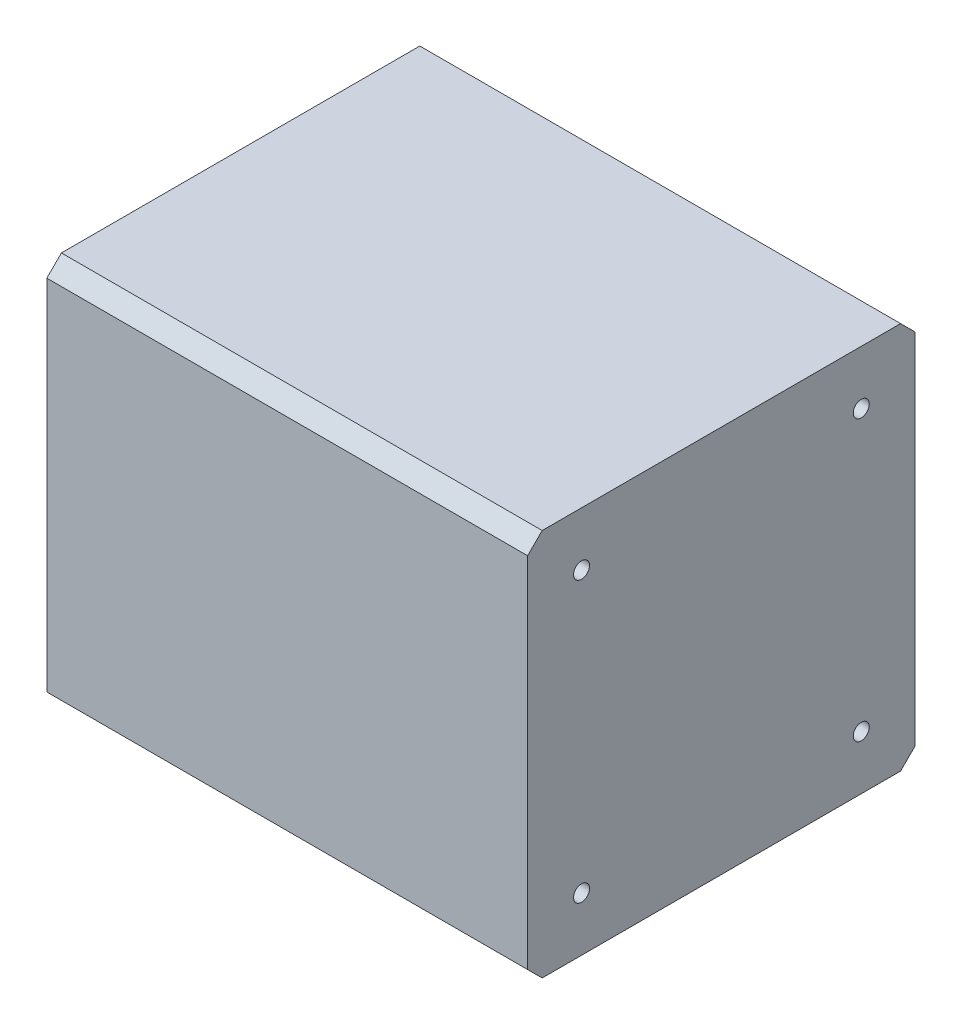
ISO-10303-21;
HEADER;
FILE_DESCRIPTION(('STEP AP214'),'2;1');
FILE_NAME('part.step','',(''),(''),'','','');
FILE_SCHEMA(('AUTOMOTIVE_DESIGN { 1 0 10303 214 1 1 1 1 }'));
ENDSEC;
DATA;
#1=APPLICATION_CONTEXT('core data for automotive mechanical design processes');
#2=APPLICATION_PROTOCOL_DEFINITION('international standard','automotive_design',2000,#1);
#3=PRODUCT_CONTEXT('',#1,'mechanical');
#4=PRODUCT('Part','Part','',(#3));
#5=PRODUCT_RELATED_PRODUCT_CATEGORY('part','',(#4));
#6=PRODUCT_DEFINITION_FORMATION('','',#4);
#7=PRODUCT_DEFINITION_CONTEXT('part definition',#1,'design');
#8=PRODUCT_DEFINITION('design','',#6,#7);
#9=PRODUCT_DEFINITION_SHAPE('','',#8);
#10=(LENGTH_UNIT() NAMED_UNIT(*) SI_UNIT(.MILLI.,.METRE.));
#11=(NAMED_UNIT(*) PLANE_ANGLE_UNIT() SI_UNIT($,.RADIAN.));
#12=(NAMED_UNIT(*) SI_UNIT($,.STERADIAN.) SOLID_ANGLE_UNIT());
#13=UNCERTAINTY_MEASURE_WITH_UNIT(LENGTH_MEASURE(1.E-05),#10,'distance_accuracy_value','');
#14=(GEOMETRIC_REPRESENTATION_CONTEXT(3) GLOBAL_UNCERTAINTY_ASSIGNED_CONTEXT((#13)) GLOBAL_UNIT_ASSIGNED_CONTEXT((#10,
#11,#12)) REPRESENTATION_CONTEXT('',''));
#15=CARTESIAN_POINT('',(0.,0.,0.));
#16=DIRECTION('',(0.,0.,1.));
#17=DIRECTION('',(1.,0.,0.));
#18=AXIS2_PLACEMENT_3D('',#15,#16,#17);
#19=CARTESIAN_POINT('',(0.,0.,0.));
#20=DIRECTION('',(1.,0.,0.));
#21=DIRECTION('',(0.,0.,-1.));
#22=AXIS2_PLACEMENT_3D('',#19,#20,#21);
#23=PLANE('',#22);
#24=DIRECTION('',(0.,0.,-1.));
#25=VECTOR('',#24,1.);
#26=CARTESIAN_POINT('',(0.,-66.5,66.5));
#27=LINE('',#26,#25);
#28=CARTESIAN_POINT('',(0.,-66.5,-20.));
#29=VERTEX_POINT('',#28);
#30=CARTESIAN_POINT('',(0.,-66.5,-61.5));
#31=VERTEX_POINT('',#30);
#32=EDGE_CURVE('E254',#29,#31,#27,.T.);
#33=ORIENTED_EDGE('',*,*,#32,.F.);
#34=DIRECTION('',(0.,-1.,0.));
#35=VECTOR('',#34,1.);
#36=CARTESIAN_POINT('',(0.,-56.5,-20.));
#37=LINE('',#36,#35);
#38=CARTESIAN_POINT('',(0.,-61.25,-20.));
#39=VERTEX_POINT('',#38);
#40=EDGE_CURVE('E179',#39,#29,#37,.T.);
#41=ORIENTED_EDGE('',*,*,#40,.F.);
#42=DIRECTION('',(0.,0.,-1.));
#43=VECTOR('',#42,1.);
#44=CARTESIAN_POINT('',(0.,-61.25,61.25));
#45=LINE('',#44,#43);
#46=CARTESIAN_POINT('',(0.,-61.25,-61.25));
#47=VERTEX_POINT('',#46);
#48=EDGE_CURVE('E233',#39,#47,#45,.T.);
#49=ORIENTED_EDGE('',*,*,#48,.T.);
#50=DIRECTION('',(0.,1.,0.));
#51=VECTOR('',#50,1.);
#52=CARTESIAN_POINT('',(0.,61.25,-61.25));
#53=LINE('',#52,#51);
#54=CARTESIAN_POINT('',(0.,61.25,-61.25));
#55=VERTEX_POINT('',#54);
#56=EDGE_CURVE('E237',#47,#55,#53,.T.);
#57=ORIENTED_EDGE('',*,*,#56,.T.);
#58=DIRECTION('',(0.,0.,1.));
#59=VECTOR('',#58,1.);
#60=CARTESIAN_POINT('',(0.,61.25,61.25));
#61=LINE('',#60,#59);
#62=CARTESIAN_POINT('',(0.,61.25,61.25));
#63=VERTEX_POINT('',#62);
#64=EDGE_CURVE('E221',#55,#63,#61,.T.);
#65=ORIENTED_EDGE('',*,*,#64,.T.);
#66=DIRECTION('',(0.,-1.,0.));
#67=VECTOR('',#66,1.);
#68=CARTESIAN_POINT('',(0.,61.25,61.25));
#69=LINE('',#68,#67);
#70=CARTESIAN_POINT('',(0.,-61.25,61.25));
#71=VERTEX_POINT('',#70);
#72=EDGE_CURVE('E216',#63,#71,#69,.T.);
#73=ORIENTED_EDGE('',*,*,#72,.T.);
#74=CARTESIAN_POINT('',(0.,-61.25,20.));
#75=VERTEX_POINT('',#74);
#76=EDGE_CURVE('E234',#71,#75,#45,.T.);
#77=ORIENTED_EDGE('',*,*,#76,.T.);
#78=DIRECTION('',(0.,-1.,0.));
#79=VECTOR('',#78,1.);
#80=CARTESIAN_POINT('',(0.,-56.5,20.));
#81=LINE('',#80,#79);
#82=CARTESIAN_POINT('',(0.,-66.5,20.));
#83=VERTEX_POINT('',#82);
#84=EDGE_CURVE('E53',#75,#83,#81,.T.);
#85=ORIENTED_EDGE('',*,*,#84,.T.);
#86=CARTESIAN_POINT('',(0.,-66.5,61.5));
#87=VERTEX_POINT('',#86);
#88=EDGE_CURVE('E173',#87,#83,#27,.T.);
#89=ORIENTED_EDGE('',*,*,#88,.F.);
#90=DIRECTION('',(0.,-0.707106781186549,-0.707106781186546));
#91=VECTOR('',#90,1.);
#92=CARTESIAN_POINT('',(0.,-66.5,61.5));
#93=LINE('',#92,#91);
#94=CARTESIAN_POINT('',(0.,-61.5,66.5));
#95=VERTEX_POINT('',#94);
#96=EDGE_CURVE('E271',#87,#95,#93,.F.);
#97=ORIENTED_EDGE('',*,*,#96,.T.);
#98=DIRECTION('',(0.,-1.,0.));
#99=VECTOR('',#98,1.);
#100=CARTESIAN_POINT('',(0.,66.5,66.5));
#101=LINE('',#100,#99);
#102=CARTESIAN_POINT('',(0.,61.5,66.5));
#103=VERTEX_POINT('',#102);
#104=EDGE_CURVE('E252',#103,#95,#101,.T.);
#105=ORIENTED_EDGE('',*,*,#104,.F.);
#106=DIRECTION('',(0.,-0.707106781186548,0.707106781186548));
#107=VECTOR('',#106,1.);
#108=CARTESIAN_POINT('',(0.,61.5,66.5));
#109=LINE('',#108,#107);
#110=CARTESIAN_POINT('',(0.,66.5,61.5));
#111=VERTEX_POINT('',#110);
#112=EDGE_CURVE('E267',#103,#111,#109,.F.);
#113=ORIENTED_EDGE('',*,*,#112,.T.);
#114=DIRECTION('',(0.,0.,1.));
#115=VECTOR('',#114,1.);
#116=CARTESIAN_POINT('',(0.,66.5,66.5));
#117=LINE('',#116,#115);
#118=CARTESIAN_POINT('',(0.,66.5,-61.5));
#119=VERTEX_POINT('',#118);
#120=EDGE_CURVE('E259',#119,#111,#117,.T.);
#121=ORIENTED_EDGE('',*,*,#120,.F.);
#122=DIRECTION('',(0.,0.707106781186549,0.707106781186546));
#123=VECTOR('',#122,1.);
#124=CARTESIAN_POINT('',(0.,66.5,-61.5));
#125=LINE('',#124,#123);
#126=CARTESIAN_POINT('',(0.,61.5,-66.5));
#127=VERTEX_POINT('',#126);
#128=EDGE_CURVE('E269',#119,#127,#125,.F.);
#129=ORIENTED_EDGE('',*,*,#128,.T.);
#130=DIRECTION('',(0.,1.,0.));
#131=VECTOR('',#130,1.);
#132=CARTESIAN_POINT('',(0.,66.5,-66.5));
#133=LINE('',#132,#131);
#134=CARTESIAN_POINT('',(0.,-61.5,-66.5));
#135=VERTEX_POINT('',#134);
#136=EDGE_CURVE('E256',#135,#127,#133,.T.);
#137=ORIENTED_EDGE('',*,*,#136,.F.);
#138=DIRECTION('',(0.,0.707106781186546,-0.707106781186549));
#139=VECTOR('',#138,1.);
#140=CARTESIAN_POINT('',(0.,-61.5,-66.5));
#141=LINE('',#140,#139);
#142=EDGE_CURVE('E273',#135,#31,#141,.F.);
#143=ORIENTED_EDGE('',*,*,#142,.T.);
#144=EDGE_LOOP('',(#33,#41,#49,#57,#65,#73,#77,#85,#89,#97,#105,#113,#121,#129,#137,#143));
#145=FACE_BOUND('',#144,.T.);
#146=ADVANCED_FACE('F37',(#145),#23,.F.);
#147=CARTESIAN_POINT('',(160.,66.5,66.5));
#148=DIRECTION('',(0.,0.,-1.));
#149=DIRECTION('',(0.,1.,0.));
#150=AXIS2_PLACEMENT_3D('',#147,#148,#149);
#151=PLANE('',#150);
#152=ORIENTED_EDGE('',*,*,#104,.T.);
#153=DIRECTION('',(1.,0.,0.));
#154=VECTOR('',#153,1.);
#155=CARTESIAN_POINT('',(160.,-61.5,66.5));
#156=LINE('',#155,#154);
#157=CARTESIAN_POINT('',(165.,-61.5,66.5));
#158=VERTEX_POINT('',#157);
#159=EDGE_CURVE('E61',#95,#158,#156,.T.);
#160=ORIENTED_EDGE('',*,*,#159,.T.);
#161=DIRECTION('',(0.,-1.,0.));
#162=VECTOR('',#161,1.);
#163=CARTESIAN_POINT('',(165.,66.5,66.5));
#164=LINE('',#163,#162);
#165=CARTESIAN_POINT('',(165.,61.5,66.5));
#166=VERTEX_POINT('',#165);
#167=EDGE_CURVE('E211',#166,#158,#164,.T.);
#168=ORIENTED_EDGE('',*,*,#167,.F.);
#169=DIRECTION('',(-1.,0.,0.));
#170=VECTOR('',#169,1.);
#171=CARTESIAN_POINT('',(160.,61.5,66.5));
#172=LINE('',#171,#170);
#173=EDGE_CURVE('E288',#166,#103,#172,.T.);
#174=ORIENTED_EDGE('',*,*,#173,.T.);
#175=EDGE_LOOP('',(#152,#160,#168,#174));
#176=FACE_BOUND('',#175,.T.);
#177=ADVANCED_FACE('F334',(#176),#151,.F.);
#178=CARTESIAN_POINT('',(160.,-66.5,66.5));
#179=DIRECTION('',(0.,1.,0.));
#180=DIRECTION('',(0.,0.,1.));
#181=AXIS2_PLACEMENT_3D('',#178,#179,#180);
#182=PLANE('',#181);
#183=CARTESIAN_POINT('',(40.,-66.5,0.));
#184=DIRECTION('',(0.,-1.,0.));
#185=DIRECTION('',(0.,0.,-1.));
#186=AXIS2_PLACEMENT_3D('',#183,#184,#185);
#187=CIRCLE('',#186,20.);
#188=CARTESIAN_POINT('',(40.,-66.5,-20.));
#189=VERTEX_POINT('',#188);
#190=CARTESIAN_POINT('',(40.,-66.5,20.));
#191=VERTEX_POINT('',#190);
#192=EDGE_CURVE('E161',#189,#191,#187,.T.);
#193=ORIENTED_EDGE('',*,*,#192,.F.);
#194=DIRECTION('',(1.,0.,0.));
#195=VECTOR('',#194,1.);
#196=CARTESIAN_POINT('',(40.,-66.5,-20.));
#197=LINE('',#196,#195);
#198=EDGE_CURVE('E158',#29,#189,#197,.T.);
#199=ORIENTED_EDGE('',*,*,#198,.F.);
#200=ORIENTED_EDGE('',*,*,#32,.T.);
#201=DIRECTION('',(1.,0.,0.));
#202=VECTOR('',#201,1.);
#203=CARTESIAN_POINT('',(160.,-66.5,-61.5));
#204=LINE('',#203,#202);
#205=CARTESIAN_POINT('',(165.,-66.5,-61.5));
#206=VERTEX_POINT('',#205);
#207=EDGE_CURVE('E278',#31,#206,#204,.T.);
#208=ORIENTED_EDGE('',*,*,#207,.T.);
#209=DIRECTION('',(0.,0.,-1.));
#210=VECTOR('',#209,1.);
#211=CARTESIAN_POINT('',(165.,-66.5,66.5));
#212=LINE('',#211,#210);
#213=CARTESIAN_POINT('',(165.,-66.5,61.5));
#214=VERTEX_POINT('',#213);
#215=EDGE_CURVE('E213',#214,#206,#212,.T.);
#216=ORIENTED_EDGE('',*,*,#215,.F.);
#217=DIRECTION('',(-1.,0.,0.));
#218=VECTOR('',#217,1.);
#219=CARTESIAN_POINT('',(160.,-66.5,61.5));
#220=LINE('',#219,#218);
#221=EDGE_CURVE('E276',#214,#87,#220,.T.);
#222=ORIENTED_EDGE('',*,*,#221,.T.);
#223=ORIENTED_EDGE('',*,*,#88,.T.);
#224=DIRECTION('',(-1.,0.,0.));
#225=VECTOR('',#224,1.);
#226=CARTESIAN_POINT('',(40.,-66.5,20.));
#227=LINE('',#226,#225);
#228=EDGE_CURVE('E154',#191,#83,#227,.T.);
#229=ORIENTED_EDGE('',*,*,#228,.F.);
#230=EDGE_LOOP('',(#193,#199,#200,#208,#216,#222,#223,#229));
#231=FACE_BOUND('',#230,.T.);
#232=ADVANCED_FACE('F170',(#231),#182,.F.);
#233=CARTESIAN_POINT('',(160.,66.5,-66.5));
#234=DIRECTION('',(0.,0.,1.));
#235=DIRECTION('',(0.,-1.,0.));
#236=AXIS2_PLACEMENT_3D('',#233,#234,#235);
#237=PLANE('',#236);
#238=DIRECTION('',(0.,1.,0.));
#239=VECTOR('',#238,1.);
#240=CARTESIAN_POINT('',(165.,-66.5,-66.5));
#241=LINE('',#240,#239);
#242=CARTESIAN_POINT('',(165.,-61.5,-66.5));
#243=VERTEX_POINT('',#242);
#244=CARTESIAN_POINT('',(165.,61.5,-66.5));
#245=VERTEX_POINT('',#244);
#246=EDGE_CURVE('E203',#243,#245,#241,.T.);
#247=ORIENTED_EDGE('',*,*,#246,.F.);
#248=DIRECTION('',(-1.,0.,0.));
#249=VECTOR('',#248,1.);
#250=CARTESIAN_POINT('',(160.,-61.5,-66.5));
#251=LINE('',#250,#249);
#252=EDGE_CURVE('E264',#243,#135,#251,.T.);
#253=ORIENTED_EDGE('',*,*,#252,.T.);
#254=ORIENTED_EDGE('',*,*,#136,.T.);
#255=DIRECTION('',(1.,0.,0.));
#256=VECTOR('',#255,1.);
#257=CARTESIAN_POINT('',(160.,61.5,-66.5));
#258=LINE('',#257,#256);
#259=EDGE_CURVE('E262',#127,#245,#258,.T.);
#260=ORIENTED_EDGE('',*,*,#259,.T.);
#261=EDGE_LOOP('',(#247,#253,#254,#260));
#262=FACE_BOUND('',#261,.T.);
#263=ADVANCED_FACE('F320',(#262),#237,.F.);
#264=CARTESIAN_POINT('',(160.,66.5,66.5));
#265=DIRECTION('',(0.,-1.,0.));
#266=DIRECTION('',(0.,0.,-1.));
#267=AXIS2_PLACEMENT_3D('',#264,#265,#266);
#268=PLANE('',#267);
#269=DIRECTION('',(0.,0.,1.));
#270=VECTOR('',#269,1.);
#271=CARTESIAN_POINT('',(165.,66.5,-66.5));
#272=LINE('',#271,#270);
#273=CARTESIAN_POINT('',(165.,66.5,-61.5));
#274=VERTEX_POINT('',#273);
#275=CARTESIAN_POINT('',(165.,66.5,61.5));
#276=VERTEX_POINT('',#275);
#277=EDGE_CURVE('E208',#274,#276,#272,.T.);
#278=ORIENTED_EDGE('',*,*,#277,.F.);
#279=DIRECTION('',(-1.,0.,0.));
#280=VECTOR('',#279,1.);
#281=CARTESIAN_POINT('',(160.,66.5,-61.5));
#282=LINE('',#281,#280);
#283=EDGE_CURVE('E294',#274,#119,#282,.T.);
#284=ORIENTED_EDGE('',*,*,#283,.T.);
#285=ORIENTED_EDGE('',*,*,#120,.T.);
#286=DIRECTION('',(1.,0.,0.));
#287=VECTOR('',#286,1.);
#288=CARTESIAN_POINT('',(160.,66.5,61.5));
#289=LINE('',#288,#287);
#290=EDGE_CURVE('E292',#111,#276,#289,.T.);
#291=ORIENTED_EDGE('',*,*,#290,.T.);
#292=EDGE_LOOP('',(#278,#284,#285,#291));
#293=FACE_BOUND('',#292,.T.);
#294=ADVANCED_FACE('F328',(#293),#268,.F.);
#295=CARTESIAN_POINT('',(160.,61.25,61.25));
#296=DIRECTION('',(0.,0.,-1.));
#297=DIRECTION('',(0.,1.,0.));
#298=AXIS2_PLACEMENT_3D('',#295,#296,#297);
#299=PLANE('',#298);
#300=ORIENTED_EDGE('',*,*,#72,.F.);
#301=DIRECTION('',(-1.,0.,0.));
#302=VECTOR('',#301,1.);
#303=CARTESIAN_POINT('',(160.,61.25,61.25));
#304=LINE('',#303,#302);
#305=CARTESIAN_POINT('',(160.,61.25,61.25));
#306=VERTEX_POINT('',#305);
#307=EDGE_CURVE('E230',#306,#63,#304,.T.);
#308=ORIENTED_EDGE('',*,*,#307,.F.);
#309=DIRECTION('',(0.,-1.,0.));
#310=VECTOR('',#309,1.);
#311=CARTESIAN_POINT('',(160.,61.25,61.25));
#312=LINE('',#311,#310);
#313=CARTESIAN_POINT('',(160.,-61.25,61.25));
#314=VERTEX_POINT('',#313);
#315=EDGE_CURVE('E217',#306,#314,#312,.T.);
#316=ORIENTED_EDGE('',*,*,#315,.T.);
#317=DIRECTION('',(-1.,0.,0.));
#318=VECTOR('',#317,1.);
#319=CARTESIAN_POINT('',(160.,-61.25,61.25));
#320=LINE('',#319,#318);
#321=EDGE_CURVE('E249',#314,#71,#320,.T.);
#322=ORIENTED_EDGE('',*,*,#321,.T.);
#323=EDGE_LOOP('',(#300,#308,#316,#322));
#324=FACE_BOUND('',#323,.T.);
#325=ADVANCED_FACE('F357',(#324),#299,.T.);
#326=CARTESIAN_POINT('',(160.,-61.25,61.25));
#327=DIRECTION('',(0.,1.,0.));
#328=DIRECTION('',(0.,0.,1.));
#329=AXIS2_PLACEMENT_3D('',#326,#327,#328);
#330=PLANE('',#329);
#331=DIRECTION('',(-1.,0.,0.));
#332=VECTOR('',#331,1.);
#333=CARTESIAN_POINT('',(160.,-61.25,-20.));
#334=LINE('',#333,#332);
#335=CARTESIAN_POINT('',(40.,-61.25,-20.));
#336=VERTEX_POINT('',#335);
#337=EDGE_CURVE('E11',#336,#39,#334,.T.);
#338=ORIENTED_EDGE('',*,*,#337,.F.);
#339=CARTESIAN_POINT('',(40.,-61.25,0.));
#340=DIRECTION('',(0.,1.,0.));
#341=DIRECTION('',(0.,0.,1.));
#342=AXIS2_PLACEMENT_3D('',#339,#340,#341);
#343=CIRCLE('',#342,20.);
#344=CARTESIAN_POINT('',(40.,-61.25,20.));
#345=VERTEX_POINT('',#344);
#346=EDGE_CURVE('E46',#345,#336,#343,.T.);
#347=ORIENTED_EDGE('',*,*,#346,.F.);
#348=DIRECTION('',(1.,0.,0.));
#349=VECTOR('',#348,1.);
#350=CARTESIAN_POINT('',(160.,-61.25,20.));
#351=LINE('',#350,#349);
#352=EDGE_CURVE('E155',#75,#345,#351,.T.);
#353=ORIENTED_EDGE('',*,*,#352,.F.);
#354=ORIENTED_EDGE('',*,*,#76,.F.);
#355=ORIENTED_EDGE('',*,*,#321,.F.);
#356=DIRECTION('',(0.,0.,-1.));
#357=VECTOR('',#356,1.);
#358=CARTESIAN_POINT('',(160.,-61.25,61.25));
#359=LINE('',#358,#357);
#360=CARTESIAN_POINT('',(160.,-61.25,-61.25));
#361=VERTEX_POINT('',#360);
#362=EDGE_CURVE('E220',#314,#361,#359,.T.);
#363=ORIENTED_EDGE('',*,*,#362,.T.);
#364=DIRECTION('',(-1.,0.,0.));
#365=VECTOR('',#364,1.);
#366=CARTESIAN_POINT('',(160.,-61.25,-61.25));
#367=LINE('',#366,#365);
#368=EDGE_CURVE('E246',#361,#47,#367,.T.);
#369=ORIENTED_EDGE('',*,*,#368,.T.);
#370=ORIENTED_EDGE('',*,*,#48,.F.);
#371=EDGE_LOOP('',(#338,#347,#353,#354,#355,#363,#369,#370));
#372=FACE_BOUND('',#371,.T.);
#373=ADVANCED_FACE('F303',(#372),#330,.T.);
#374=CARTESIAN_POINT('',(160.,61.25,-61.25));
#375=DIRECTION('',(0.,0.,1.));
#376=DIRECTION('',(0.,-1.,0.));
#377=AXIS2_PLACEMENT_3D('',#374,#375,#376);
#378=PLANE('',#377);
#379=ORIENTED_EDGE('',*,*,#56,.F.);
#380=ORIENTED_EDGE('',*,*,#368,.F.);
#381=DIRECTION('',(0.,1.,0.));
#382=VECTOR('',#381,1.);
#383=CARTESIAN_POINT('',(160.,61.25,-61.25));
#384=LINE('',#383,#382);
#385=CARTESIAN_POINT('',(160.,61.25,-61.25));
#386=VERTEX_POINT('',#385);
#387=EDGE_CURVE('E224',#361,#386,#384,.T.);
#388=ORIENTED_EDGE('',*,*,#387,.T.);
#389=DIRECTION('',(-1.,0.,0.));
#390=VECTOR('',#389,1.);
#391=CARTESIAN_POINT('',(160.,61.25,-61.25));
#392=LINE('',#391,#390);
#393=EDGE_CURVE('E244',#386,#55,#392,.T.);
#394=ORIENTED_EDGE('',*,*,#393,.T.);
#395=EDGE_LOOP('',(#379,#380,#388,#394));
#396=FACE_BOUND('',#395,.T.);
#397=ADVANCED_FACE('F381',(#396),#378,.T.);
#398=CARTESIAN_POINT('',(160.,61.25,61.25));
#399=DIRECTION('',(0.,-1.,0.));
#400=DIRECTION('',(0.,0.,-1.));
#401=AXIS2_PLACEMENT_3D('',#398,#399,#400);
#402=PLANE('',#401);
#403=ORIENTED_EDGE('',*,*,#64,.F.);
#404=ORIENTED_EDGE('',*,*,#393,.F.);
#405=DIRECTION('',(0.,0.,1.));
#406=VECTOR('',#405,1.);
#407=CARTESIAN_POINT('',(160.,61.25,61.25));
#408=LINE('',#407,#406);
#409=EDGE_CURVE('E227',#386,#306,#408,.T.);
#410=ORIENTED_EDGE('',*,*,#409,.T.);
#411=ORIENTED_EDGE('',*,*,#307,.T.);
#412=EDGE_LOOP('',(#403,#404,#410,#411));
#413=FACE_BOUND('',#412,.T.);
#414=ADVANCED_FACE('F433',(#413),#402,.T.);
#415=CARTESIAN_POINT('',(160.,0.,0.));
#416=DIRECTION('',(1.,0.,0.));
#417=DIRECTION('',(0.,0.,-1.));
#418=AXIS2_PLACEMENT_3D('',#415,#416,#417);
#419=PLANE('',#418);
#420=CARTESIAN_POINT('',(160.,48.,48.));
#421=DIRECTION('',(1.,0.,0.));
#422=DIRECTION('',(0.,0.,-1.));
#423=AXIS2_PLACEMENT_3D('',#420,#421,#422);
#424=CIRCLE('',#423,2.75);
#425=CARTESIAN_POINT('',(160.,48.,45.25));
#426=VERTEX_POINT('',#425);
#427=EDGE_CURVE('E195',#426,#426,#424,.T.);
#428=ORIENTED_EDGE('',*,*,#427,.T.);
#429=EDGE_LOOP('',(#428));
#430=FACE_BOUND('',#429,.T.);
#431=CARTESIAN_POINT('',(160.,-48.,48.));
#432=DIRECTION('',(1.,0.,0.));
#433=DIRECTION('',(0.,0.,-1.));
#434=AXIS2_PLACEMENT_3D('',#431,#432,#433);
#435=CIRCLE('',#434,2.75);
#436=CARTESIAN_POINT('',(160.,-48.,45.25));
#437=VERTEX_POINT('',#436);
#438=EDGE_CURVE('E189',#437,#437,#435,.T.);
#439=ORIENTED_EDGE('',*,*,#438,.T.);
#440=EDGE_LOOP('',(#439));
#441=FACE_BOUND('',#440,.T.);
#442=CARTESIAN_POINT('',(160.,-48.,-48.));
#443=DIRECTION('',(1.,0.,0.));
#444=DIRECTION('',(0.,0.,-1.));
#445=AXIS2_PLACEMENT_3D('',#442,#443,#444);
#446=CIRCLE('',#445,2.75);
#447=CARTESIAN_POINT('',(160.,-48.,-50.75));
#448=VERTEX_POINT('',#447);
#449=EDGE_CURVE('E182',#448,#448,#446,.T.);
#450=ORIENTED_EDGE('',*,*,#449,.T.);
#451=EDGE_LOOP('',(#450));
#452=FACE_BOUND('',#451,.T.);
#453=CARTESIAN_POINT('',(160.,48.,-48.));
#454=DIRECTION('',(1.,0.,0.));
#455=DIRECTION('',(0.,0.,-1.));
#456=AXIS2_PLACEMENT_3D('',#453,#454,#455);
#457=CIRCLE('',#456,2.75);
#458=CARTESIAN_POINT('',(160.,48.,-50.75));
#459=VERTEX_POINT('',#458);
#460=EDGE_CURVE('E200',#459,#459,#457,.T.);
#461=ORIENTED_EDGE('',*,*,#460,.T.);
#462=EDGE_LOOP('',(#461));
#463=FACE_BOUND('',#462,.T.);
#464=ORIENTED_EDGE('',*,*,#362,.F.);
#465=ORIENTED_EDGE('',*,*,#315,.F.);
#466=ORIENTED_EDGE('',*,*,#409,.F.);
#467=ORIENTED_EDGE('',*,*,#387,.F.);
#468=EDGE_LOOP('',(#464,#465,#466,#467));
#469=FACE_BOUND('',#468,.T.);
#470=ADVANCED_FACE('F429',(#430,#441,#452,#463,#469),#419,.F.);
#471=CARTESIAN_POINT('',(165.,0.,0.));
#472=DIRECTION('',(1.,0.,0.));
#473=DIRECTION('',(0.,0.,-1.));
#474=AXIS2_PLACEMENT_3D('',#471,#472,#473);
#475=PLANE('',#474);
#476=CARTESIAN_POINT('',(165.,48.,48.));
#477=DIRECTION('',(1.,0.,0.));
#478=DIRECTION('',(0.,0.,-1.));
#479=AXIS2_PLACEMENT_3D('',#476,#477,#478);
#480=CIRCLE('',#479,2.75);
#481=CARTESIAN_POINT('',(165.,48.,45.25));
#482=VERTEX_POINT('',#481);
#483=EDGE_CURVE('E178',#482,#482,#480,.T.);
#484=ORIENTED_EDGE('',*,*,#483,.F.);
#485=EDGE_LOOP('',(#484));
#486=FACE_BOUND('',#485,.T.);
#487=CARTESIAN_POINT('',(165.,-48.,48.));
#488=DIRECTION('',(1.,0.,0.));
#489=DIRECTION('',(0.,0.,-1.));
#490=AXIS2_PLACEMENT_3D('',#487,#488,#489);
#491=CIRCLE('',#490,2.75);
#492=CARTESIAN_POINT('',(165.,-48.,45.25));
#493=VERTEX_POINT('',#492);
#494=EDGE_CURVE('E192',#493,#493,#491,.T.);
#495=ORIENTED_EDGE('',*,*,#494,.F.);
#496=EDGE_LOOP('',(#495));
#497=FACE_BOUND('',#496,.T.);
#498=CARTESIAN_POINT('',(165.,-48.,-48.));
#499=DIRECTION('',(1.,0.,0.));
#500=DIRECTION('',(0.,0.,-1.));
#501=AXIS2_PLACEMENT_3D('',#498,#499,#500);
#502=CIRCLE('',#501,2.75);
#503=CARTESIAN_POINT('',(165.,-48.,-50.75));
#504=VERTEX_POINT('',#503);
#505=EDGE_CURVE('E186',#504,#504,#502,.T.);
#506=ORIENTED_EDGE('',*,*,#505,.F.);
#507=EDGE_LOOP('',(#506));
#508=FACE_BOUND('',#507,.T.);
#509=CARTESIAN_POINT('',(165.,48.,-48.));
#510=DIRECTION('',(1.,0.,0.));
#511=DIRECTION('',(0.,0.,-1.));
#512=AXIS2_PLACEMENT_3D('',#509,#510,#511);
#513=CIRCLE('',#512,2.75);
#514=CARTESIAN_POINT('',(165.,48.,-50.75));
#515=VERTEX_POINT('',#514);
#516=EDGE_CURVE('E185',#515,#515,#513,.T.);
#517=ORIENTED_EDGE('',*,*,#516,.F.);
#518=EDGE_LOOP('',(#517));
#519=FACE_BOUND('',#518,.T.);
#520=ORIENTED_EDGE('',*,*,#215,.T.);
#521=DIRECTION('',(0.,-0.707106781186546,0.707106781186549));
#522=VECTOR('',#521,1.);
#523=CARTESIAN_POINT('',(165.,-64.0000000000002,-63.9999999999998));
#524=LINE('',#523,#522);
#525=EDGE_CURVE('E286',#206,#243,#524,.F.);
#526=ORIENTED_EDGE('',*,*,#525,.T.);
#527=ORIENTED_EDGE('',*,*,#246,.T.);
#528=DIRECTION('',(0.,-0.707106781186549,-0.707106781186546));
#529=VECTOR('',#528,1.);
#530=CARTESIAN_POINT('',(165.,63.9999999999998,-64.0000000000002));
#531=LINE('',#530,#529);
#532=EDGE_CURVE('E282',#245,#274,#531,.F.);
#533=ORIENTED_EDGE('',*,*,#532,.T.);
#534=ORIENTED_EDGE('',*,*,#277,.T.);
#535=DIRECTION('',(0.,0.707106781186548,-0.707106781186548));
#536=VECTOR('',#535,1.);
#537=CARTESIAN_POINT('',(165.,64.,64.));
#538=LINE('',#537,#536);
#539=EDGE_CURVE('E280',#276,#166,#538,.F.);
#540=ORIENTED_EDGE('',*,*,#539,.T.);
#541=ORIENTED_EDGE('',*,*,#167,.T.);
#542=DIRECTION('',(0.,0.707106781186549,0.707106781186546));
#543=VECTOR('',#542,1.);
#544=CARTESIAN_POINT('',(165.,-63.9999999999998,64.0000000000002));
#545=LINE('',#544,#543);
#546=EDGE_CURVE('E284',#158,#214,#545,.F.);
#547=ORIENTED_EDGE('',*,*,#546,.T.);
#548=EDGE_LOOP('',(#520,#526,#527,#533,#534,#540,#541,#547));
#549=FACE_BOUND('',#548,.T.);
#550=ADVANCED_FACE('F317',(#486,#497,#508,#519,#549),#475,.T.);
#551=CARTESIAN_POINT('',(160.,-61.5,-66.5));
#552=DIRECTION('',(0.,0.707106781186549,0.707106781186545));
#553=DIRECTION('',(-1.,0.,0.));
#554=AXIS2_PLACEMENT_3D('',#551,#552,#553);
#555=PLANE('',#554);
#556=ORIENTED_EDGE('',*,*,#525,.F.);
#557=ORIENTED_EDGE('',*,*,#207,.F.);
#558=ORIENTED_EDGE('',*,*,#142,.F.);
#559=ORIENTED_EDGE('',*,*,#252,.F.);
#560=EDGE_LOOP('',(#556,#557,#558,#559));
#561=FACE_BOUND('',#560,.T.);
#562=ADVANCED_FACE('F314',(#561),#555,.F.);
#563=CARTESIAN_POINT('',(160.,-66.5,61.5));
#564=DIRECTION('',(0.,0.707106781186546,-0.707106781186549));
#565=DIRECTION('',(-1.,0.,0.));
#566=AXIS2_PLACEMENT_3D('',#563,#564,#565);
#567=PLANE('',#566);
#568=ORIENTED_EDGE('',*,*,#546,.F.);
#569=ORIENTED_EDGE('',*,*,#159,.F.);
#570=ORIENTED_EDGE('',*,*,#96,.F.);
#571=ORIENTED_EDGE('',*,*,#221,.F.);
#572=EDGE_LOOP('',(#568,#569,#570,#571));
#573=FACE_BOUND('',#572,.T.);
#574=ADVANCED_FACE('F338',(#573),#567,.F.);
#575=CARTESIAN_POINT('',(160.,66.5,-61.5));
#576=DIRECTION('',(0.,-0.707106781186545,0.707106781186549));
#577=DIRECTION('',(-1.,0.,0.));
#578=AXIS2_PLACEMENT_3D('',#575,#576,#577);
#579=PLANE('',#578);
#580=ORIENTED_EDGE('',*,*,#532,.F.);
#581=ORIENTED_EDGE('',*,*,#259,.F.);
#582=ORIENTED_EDGE('',*,*,#128,.F.);
#583=ORIENTED_EDGE('',*,*,#283,.F.);
#584=EDGE_LOOP('',(#580,#581,#582,#583));
#585=FACE_BOUND('',#584,.T.);
#586=ADVANCED_FACE('F323',(#585),#579,.F.);
#587=CARTESIAN_POINT('',(160.,61.5,66.5));
#588=DIRECTION('',(0.,-0.707106781186548,-0.707106781186548));
#589=DIRECTION('',(-1.,0.,0.));
#590=AXIS2_PLACEMENT_3D('',#587,#588,#589);
#591=PLANE('',#590);
#592=ORIENTED_EDGE('',*,*,#539,.F.);
#593=ORIENTED_EDGE('',*,*,#290,.F.);
#594=ORIENTED_EDGE('',*,*,#112,.F.);
#595=ORIENTED_EDGE('',*,*,#173,.F.);
#596=EDGE_LOOP('',(#592,#593,#594,#595));
#597=FACE_BOUND('',#596,.T.);
#598=ADVANCED_FACE('F40',(#597),#591,.F.);
#599=CARTESIAN_POINT('',(160.,48.,-48.));
#600=DIRECTION('',(1.,0.,0.));
#601=DIRECTION('',(0.,0.,-1.));
#602=AXIS2_PLACEMENT_3D('',#599,#600,#601);
#603=CYLINDRICAL_SURFACE('',#602,2.75);
#604=ORIENTED_EDGE('',*,*,#460,.F.);
#605=EDGE_LOOP('',(#604));
#606=FACE_BOUND('',#605,.T.);
#607=ORIENTED_EDGE('',*,*,#516,.T.);
#608=EDGE_LOOP('',(#607));
#609=FACE_BOUND('',#608,.T.);
#610=ADVANCED_FACE('F417',(#606,#609),#603,.F.);
#611=CARTESIAN_POINT('',(160.,-48.,-48.));
#612=DIRECTION('',(1.,0.,0.));
#613=DIRECTION('',(0.,0.,-1.));
#614=AXIS2_PLACEMENT_3D('',#611,#612,#613);
#615=CYLINDRICAL_SURFACE('',#614,2.75);
#616=ORIENTED_EDGE('',*,*,#449,.F.);
#617=EDGE_LOOP('',(#616));
#618=FACE_BOUND('',#617,.T.);
#619=ORIENTED_EDGE('',*,*,#505,.T.);
#620=EDGE_LOOP('',(#619));
#621=FACE_BOUND('',#620,.T.);
#622=ADVANCED_FACE('F413',(#618,#621),#615,.F.);
#623=CARTESIAN_POINT('',(160.,-48.,48.));
#624=DIRECTION('',(1.,0.,0.));
#625=DIRECTION('',(0.,0.,-1.));
#626=AXIS2_PLACEMENT_3D('',#623,#624,#625);
#627=CYLINDRICAL_SURFACE('',#626,2.75);
#628=ORIENTED_EDGE('',*,*,#438,.F.);
#629=EDGE_LOOP('',(#628));
#630=FACE_BOUND('',#629,.T.);
#631=ORIENTED_EDGE('',*,*,#494,.T.);
#632=EDGE_LOOP('',(#631));
#633=FACE_BOUND('',#632,.T.);
#634=ADVANCED_FACE('F416',(#630,#633),#627,.F.);
#635=CARTESIAN_POINT('',(160.,48.,48.));
#636=DIRECTION('',(1.,0.,0.));
#637=DIRECTION('',(0.,0.,-1.));
#638=AXIS2_PLACEMENT_3D('',#635,#636,#637);
#639=CYLINDRICAL_SURFACE('',#638,2.75);
#640=ORIENTED_EDGE('',*,*,#427,.F.);
#641=EDGE_LOOP('',(#640));
#642=FACE_BOUND('',#641,.T.);
#643=ORIENTED_EDGE('',*,*,#483,.T.);
#644=EDGE_LOOP('',(#643));
#645=FACE_BOUND('',#644,.T.);
#646=ADVANCED_FACE('F390',(#642,#645),#639,.F.);
#647=CARTESIAN_POINT('',(40.,-56.5,0.));
#648=DIRECTION('',(0.,-1.,0.));
#649=DIRECTION('',(0.,0.,-1.));
#650=AXIS2_PLACEMENT_3D('',#647,#648,#649);
#651=CYLINDRICAL_SURFACE('',#650,20.);
#652=ORIENTED_EDGE('',*,*,#346,.T.);
#653=DIRECTION('',(0.,-1.,0.));
#654=VECTOR('',#653,1.);
#655=CARTESIAN_POINT('',(40.,-56.5,-20.));
#656=LINE('',#655,#654);
#657=EDGE_CURVE('E164',#336,#189,#656,.T.);
#658=ORIENTED_EDGE('',*,*,#657,.T.);
#659=ORIENTED_EDGE('',*,*,#192,.T.);
#660=DIRECTION('',(0.,-1.,0.));
#661=VECTOR('',#660,1.);
#662=CARTESIAN_POINT('',(40.,-56.5,20.));
#663=LINE('',#662,#661);
#664=EDGE_CURVE('E150',#345,#191,#663,.T.);
#665=ORIENTED_EDGE('',*,*,#664,.F.);
#666=EDGE_LOOP('',(#652,#658,#659,#665));
#667=FACE_BOUND('',#666,.T.);
#668=ADVANCED_FACE('F162',(#667),#651,.F.);
#669=CARTESIAN_POINT('',(40.,-56.5,-20.));
#670=DIRECTION('',(0.,0.,-1.));
#671=DIRECTION('',(-1.,0.,0.));
#672=AXIS2_PLACEMENT_3D('',#669,#670,#671);
#673=PLANE('',#672);
#674=ORIENTED_EDGE('',*,*,#337,.T.);
#675=ORIENTED_EDGE('',*,*,#40,.T.);
#676=ORIENTED_EDGE('',*,*,#198,.T.);
#677=ORIENTED_EDGE('',*,*,#657,.F.);
#678=EDGE_LOOP('',(#674,#675,#676,#677));
#679=FACE_BOUND('',#678,.T.);
#680=ADVANCED_FACE('F300',(#679),#673,.F.);
#681=CARTESIAN_POINT('',(40.,-56.5,20.));
#682=DIRECTION('',(0.,0.,1.));
#683=DIRECTION('',(1.,0.,0.));
#684=AXIS2_PLACEMENT_3D('',#681,#682,#683);
#685=PLANE('',#684);
#686=ORIENTED_EDGE('',*,*,#352,.T.);
#687=ORIENTED_EDGE('',*,*,#664,.T.);
#688=ORIENTED_EDGE('',*,*,#228,.T.);
#689=ORIENTED_EDGE('',*,*,#84,.F.);
#690=EDGE_LOOP('',(#686,#687,#688,#689));
#691=FACE_BOUND('',#690,.T.);
#692=ADVANCED_FACE('F152',(#691),#685,.F.);
#693=CLOSED_SHELL('',(#146,#177,#232,#263,#294,#325,#373,#397,#414,#470,#550,#562,#574,#586,
#598,#610,#622,#634,#646,#668,#680,#692));
#694=MANIFOLD_SOLID_BREP('B2',#693);
#695=ADVANCED_BREP_SHAPE_REPRESENTATION('',(#18,#694),#14);
#696=SHAPE_DEFINITION_REPRESENTATION(#9,#695);
ENDSEC;
END-ISO-10303-21;
